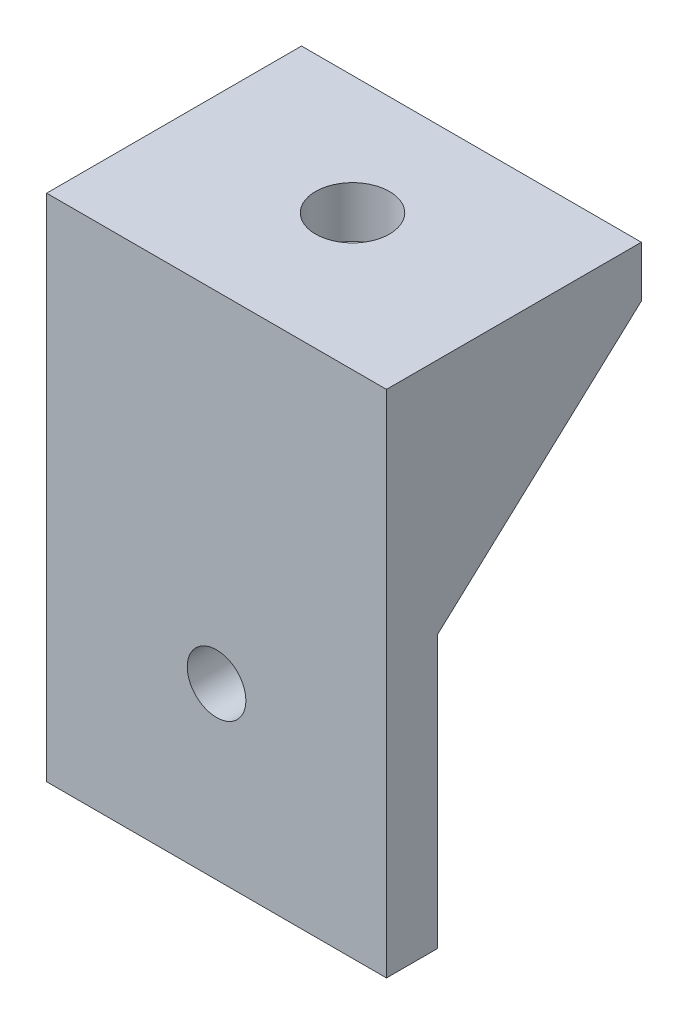
ISO-10303-21;
HEADER;
FILE_DESCRIPTION(('STEP AP214'),'2;1');
FILE_NAME('part.step','',(''),(''),'','','');
FILE_SCHEMA(('AUTOMOTIVE_DESIGN { 1 0 10303 214 1 1 1 1 }'));
ENDSEC;
DATA;
#1=APPLICATION_CONTEXT('core data for automotive mechanical design processes');
#2=APPLICATION_PROTOCOL_DEFINITION('international standard','automotive_design',2000,#1);
#3=PRODUCT_CONTEXT('',#1,'mechanical');
#4=PRODUCT('Part','Part','',(#3));
#5=PRODUCT_RELATED_PRODUCT_CATEGORY('part','',(#4));
#6=PRODUCT_DEFINITION_FORMATION('','',#4);
#7=PRODUCT_DEFINITION_CONTEXT('part definition',#1,'design');
#8=PRODUCT_DEFINITION('design','',#6,#7);
#9=PRODUCT_DEFINITION_SHAPE('','',#8);
#10=(LENGTH_UNIT() NAMED_UNIT(*) SI_UNIT(.MILLI.,.METRE.));
#11=(NAMED_UNIT(*) PLANE_ANGLE_UNIT() SI_UNIT($,.RADIAN.));
#12=(NAMED_UNIT(*) SI_UNIT($,.STERADIAN.) SOLID_ANGLE_UNIT());
#13=UNCERTAINTY_MEASURE_WITH_UNIT(LENGTH_MEASURE(1.E-05),#10,'distance_accuracy_value','');
#14=(GEOMETRIC_REPRESENTATION_CONTEXT(3) GLOBAL_UNCERTAINTY_ASSIGNED_CONTEXT((#13)) GLOBAL_UNIT_ASSIGNED_CONTEXT((#10,
#11,#12)) REPRESENTATION_CONTEXT('',''));
#15=CARTESIAN_POINT('',(0.,0.,0.));
#16=DIRECTION('',(0.,0.,1.));
#17=DIRECTION('',(1.,0.,0.));
#18=AXIS2_PLACEMENT_3D('',#15,#16,#17);
#19=CARTESIAN_POINT('',(0.,0.,0.));
#20=DIRECTION('',(0.,0.,1.));
#21=DIRECTION('',(1.,0.,0.));
#22=AXIS2_PLACEMENT_3D('',#19,#20,#21);
#23=PLANE('',#22);
#24=CARTESIAN_POINT('',(5.22292993630573,6.71974522292994,0.));
#25=DIRECTION('',(0.,0.,-1.));
#26=DIRECTION('',(-1.,0.,0.));
#27=AXIS2_PLACEMENT_3D('',#24,#25,#26);
#28=CIRCLE('',#27,1.725);
#29=CARTESIAN_POINT('',(3.49792993630573,6.71974522292994,0.));
#30=VERTEX_POINT('',#29);
#31=EDGE_CURVE('E157',#30,#30,#28,.T.);
#32=ORIENTED_EDGE('',*,*,#31,.F.);
#33=EDGE_LOOP('',(#32));
#34=FACE_BOUND('',#33,.T.);
#35=DIRECTION('',(0.,1.,0.));
#36=VECTOR('',#35,1.);
#37=CARTESIAN_POINT('',(13.2229299363057,23.7197452229299,0.));
#38=LINE('',#37,#36);
#39=CARTESIAN_POINT('',(13.2229299363057,12.7197452229299,0.));
#40=VERTEX_POINT('',#39);
#41=CARTESIAN_POINT('',(13.2229299363057,23.7197452229299,0.));
#42=VERTEX_POINT('',#41);
#43=EDGE_CURVE('E57',#40,#42,#38,.T.);
#44=ORIENTED_EDGE('',*,*,#43,.F.);
#45=DIRECTION('',(1.,0.,0.));
#46=VECTOR('',#45,1.);
#47=CARTESIAN_POINT('',(13.2229299363057,12.7197452229299,0.));
#48=LINE('',#47,#46);
#49=CARTESIAN_POINT('',(15.2229299363057,12.7197452229299,0.));
#50=VERTEX_POINT('',#49);
#51=EDGE_CURVE('E137',#40,#50,#48,.T.);
#52=ORIENTED_EDGE('',*,*,#51,.T.);
#53=DIRECTION('',(0.,1.,0.));
#54=VECTOR('',#53,1.);
#55=CARTESIAN_POINT('',(15.2229299363057,26.7197452229299,0.));
#56=LINE('',#55,#54);
#57=CARTESIAN_POINT('',(15.2229299363057,-3.28025477707006,0.));
#58=VERTEX_POINT('',#57);
#59=EDGE_CURVE('E176',#58,#50,#56,.T.);
#60=ORIENTED_EDGE('',*,*,#59,.F.);
#61=DIRECTION('',(1.,0.,0.));
#62=VECTOR('',#61,1.);
#63=CARTESIAN_POINT('',(-4.77707006369427,-3.28025477707006,0.));
#64=LINE('',#63,#62);
#65=CARTESIAN_POINT('',(-4.77707006369427,-3.28025477707006,0.));
#66=VERTEX_POINT('',#65);
#67=EDGE_CURVE('E183',#66,#58,#64,.T.);
#68=ORIENTED_EDGE('',*,*,#67,.F.);
#69=DIRECTION('',(0.,-1.,0.));
#70=VECTOR('',#69,1.);
#71=CARTESIAN_POINT('',(-4.77707006369427,26.7197452229299,0.));
#72=LINE('',#71,#70);
#73=CARTESIAN_POINT('',(-4.77707006369427,12.7197452229299,0.));
#74=VERTEX_POINT('',#73);
#75=EDGE_CURVE('E167',#74,#66,#72,.T.);
#76=ORIENTED_EDGE('',*,*,#75,.F.);
#77=DIRECTION('',(-1.,0.,0.));
#78=VECTOR('',#77,1.);
#79=CARTESIAN_POINT('',(-2.77707006369427,12.7197452229299,0.));
#80=LINE('',#79,#78);
#81=CARTESIAN_POINT('',(-2.77707006369427,12.7197452229299,0.));
#82=VERTEX_POINT('',#81);
#83=EDGE_CURVE('E151',#82,#74,#80,.T.);
#84=ORIENTED_EDGE('',*,*,#83,.F.);
#85=DIRECTION('',(0.,1.,0.));
#86=VECTOR('',#85,1.);
#87=CARTESIAN_POINT('',(-2.77707006369427,23.7197452229299,0.));
#88=LINE('',#87,#86);
#89=CARTESIAN_POINT('',(-2.77707006369427,23.7197452229299,0.));
#90=VERTEX_POINT('',#89);
#91=EDGE_CURVE('E150',#82,#90,#88,.T.);
#92=ORIENTED_EDGE('',*,*,#91,.T.);
#93=DIRECTION('',(-1.,0.,0.));
#94=VECTOR('',#93,1.);
#95=CARTESIAN_POINT('',(15.2229299363057,23.7197452229299,0.));
#96=LINE('',#95,#94);
#97=EDGE_CURVE('E165',#42,#90,#96,.T.);
#98=ORIENTED_EDGE('',*,*,#97,.F.);
#99=EDGE_LOOP('',(#44,#52,#60,#68,#76,#84,#92,#98));
#100=FACE_BOUND('',#99,.T.);
#101=ADVANCED_FACE('F39',(#34,#100),#23,.F.);
#102=CARTESIAN_POINT('',(15.2229299363057,23.7197452229299,-12.));
#103=DIRECTION('',(0.,1.,0.));
#104=DIRECTION('',(0.,0.,1.));
#105=AXIS2_PLACEMENT_3D('',#102,#103,#104);
#106=PLANE('',#105);
#107=CARTESIAN_POINT('',(5.22292993630573,23.7197452229299,-5.));
#108=DIRECTION('',(0.,1.,0.));
#109=DIRECTION('',(0.,0.,1.));
#110=AXIS2_PLACEMENT_3D('',#107,#108,#109);
#111=CIRCLE('',#110,2.175);
#112=CARTESIAN_POINT('',(5.22292993630573,23.7197452229299,-2.825));
#113=VERTEX_POINT('',#112);
#114=EDGE_CURVE('E161',#113,#113,#111,.T.);
#115=ORIENTED_EDGE('',*,*,#114,.T.);
#116=EDGE_LOOP('',(#115));
#117=FACE_BOUND('',#116,.T.);
#118=DIRECTION('',(0.,0.,-1.));
#119=VECTOR('',#118,1.);
#120=CARTESIAN_POINT('',(13.2229299363057,23.7197452229299,-12.));
#121=LINE('',#120,#119);
#122=CARTESIAN_POINT('',(13.2229299363057,23.7197452229299,-12.));
#123=VERTEX_POINT('',#122);
#124=EDGE_CURVE('E61',#42,#123,#121,.T.);
#125=ORIENTED_EDGE('',*,*,#124,.F.);
#126=ORIENTED_EDGE('',*,*,#97,.T.);
#127=DIRECTION('',(0.,0.,-1.));
#128=VECTOR('',#127,1.);
#129=CARTESIAN_POINT('',(-2.77707006369427,23.7197452229299,-12.));
#130=LINE('',#129,#128);
#131=CARTESIAN_POINT('',(-2.77707006369427,23.7197452229299,-12.));
#132=VERTEX_POINT('',#131);
#133=EDGE_CURVE('E126',#90,#132,#130,.T.);
#134=ORIENTED_EDGE('',*,*,#133,.T.);
#135=DIRECTION('',(-1.,0.,0.));
#136=VECTOR('',#135,1.);
#137=CARTESIAN_POINT('',(15.2229299363057,23.7197452229299,-12.));
#138=LINE('',#137,#136);
#139=EDGE_CURVE('E114',#123,#132,#138,.T.);
#140=ORIENTED_EDGE('',*,*,#139,.F.);
#141=EDGE_LOOP('',(#125,#126,#134,#140));
#142=FACE_BOUND('',#141,.T.);
#143=ADVANCED_FACE('F130',(#117,#142),#106,.F.);
#144=CARTESIAN_POINT('',(-4.77707006369427,26.7197452229299,3.));
#145=DIRECTION('',(1.,0.,0.));
#146=DIRECTION('',(0.,1.,0.));
#147=AXIS2_PLACEMENT_3D('',#144,#145,#146);
#148=PLANE('',#147);
#149=DIRECTION('',(0.,-0.675724628517346,0.737154140200741));
#150=VECTOR('',#149,1.);
#151=CARTESIAN_POINT('',(-4.77707006369427,12.7197452229299,0.));
#152=LINE('',#151,#150);
#153=CARTESIAN_POINT('',(-4.77707006369427,23.7197452229299,-12.));
#154=VERTEX_POINT('',#153);
#155=EDGE_CURVE('E141',#154,#74,#152,.T.);
#156=ORIENTED_EDGE('',*,*,#155,.T.);
#157=ORIENTED_EDGE('',*,*,#75,.T.);
#158=DIRECTION('',(0.,0.,-1.));
#159=VECTOR('',#158,1.);
#160=CARTESIAN_POINT('',(-4.77707006369427,-3.28025477707006,3.));
#161=LINE('',#160,#159);
#162=CARTESIAN_POINT('',(-4.77707006369427,-3.28025477707006,3.));
#163=VERTEX_POINT('',#162);
#164=EDGE_CURVE('E11',#163,#66,#161,.T.);
#165=ORIENTED_EDGE('',*,*,#164,.F.);
#166=DIRECTION('',(0.,-1.,0.));
#167=VECTOR('',#166,1.);
#168=CARTESIAN_POINT('',(-4.77707006369427,26.7197452229299,3.));
#169=LINE('',#168,#167);
#170=CARTESIAN_POINT('',(-4.77707006369427,26.7197452229299,3.));
#171=VERTEX_POINT('',#170);
#172=EDGE_CURVE('E175',#171,#163,#169,.T.);
#173=ORIENTED_EDGE('',*,*,#172,.F.);
#174=DIRECTION('',(0.,0.,-1.));
#175=VECTOR('',#174,1.);
#176=CARTESIAN_POINT('',(-4.77707006369427,26.7197452229299,3.));
#177=LINE('',#176,#175);
#178=CARTESIAN_POINT('',(-4.77707006369427,26.7197452229299,-12.));
#179=VERTEX_POINT('',#178);
#180=EDGE_CURVE('E185',#171,#179,#177,.T.);
#181=ORIENTED_EDGE('',*,*,#180,.T.);
#182=DIRECTION('',(0.,1.,0.));
#183=VECTOR('',#182,1.);
#184=CARTESIAN_POINT('',(-4.77707006369427,26.7197452229299,-12.));
#185=LINE('',#184,#183);
#186=EDGE_CURVE('E121',#154,#179,#185,.T.);
#187=ORIENTED_EDGE('',*,*,#186,.F.);
#188=EDGE_LOOP('',(#156,#157,#165,#173,#181,#187));
#189=FACE_BOUND('',#188,.T.);
#190=ADVANCED_FACE('F41',(#189),#148,.F.);
#191=CARTESIAN_POINT('',(-4.77707006369427,-3.28025477707006,3.));
#192=DIRECTION('',(0.,1.,0.));
#193=DIRECTION('',(0.,0.,1.));
#194=AXIS2_PLACEMENT_3D('',#191,#192,#193);
#195=PLANE('',#194);
#196=ORIENTED_EDGE('',*,*,#67,.T.);
#197=DIRECTION('',(0.,0.,-1.));
#198=VECTOR('',#197,1.);
#199=CARTESIAN_POINT('',(15.2229299363057,-3.28025477707006,3.));
#200=LINE('',#199,#198);
#201=CARTESIAN_POINT('',(15.2229299363057,-3.28025477707006,3.));
#202=VERTEX_POINT('',#201);
#203=EDGE_CURVE('E48',#202,#58,#200,.T.);
#204=ORIENTED_EDGE('',*,*,#203,.F.);
#205=DIRECTION('',(1.,0.,0.));
#206=VECTOR('',#205,1.);
#207=CARTESIAN_POINT('',(-4.77707006369427,-3.28025477707006,3.));
#208=LINE('',#207,#206);
#209=EDGE_CURVE('E174',#163,#202,#208,.T.);
#210=ORIENTED_EDGE('',*,*,#209,.F.);
#211=ORIENTED_EDGE('',*,*,#164,.T.);
#212=EDGE_LOOP('',(#196,#204,#210,#211));
#213=FACE_BOUND('',#212,.T.);
#214=ADVANCED_FACE('F226',(#213),#195,.F.);
#215=CARTESIAN_POINT('',(15.2229299363057,26.7197452229299,3.));
#216=DIRECTION('',(-1.,0.,0.));
#217=DIRECTION('',(0.,0.,1.));
#218=AXIS2_PLACEMENT_3D('',#215,#216,#217);
#219=PLANE('',#218);
#220=ORIENTED_EDGE('',*,*,#59,.T.);
#221=DIRECTION('',(0.,-0.675724628517346,0.737154140200741));
#222=VECTOR('',#221,1.);
#223=CARTESIAN_POINT('',(15.2229299363057,12.7197452229299,0.));
#224=LINE('',#223,#222);
#225=CARTESIAN_POINT('',(15.2229299363057,23.7197452229299,-12.));
#226=VERTEX_POINT('',#225);
#227=EDGE_CURVE('E139',#226,#50,#224,.T.);
#228=ORIENTED_EDGE('',*,*,#227,.F.);
#229=DIRECTION('',(0.,-1.,0.));
#230=VECTOR('',#229,1.);
#231=CARTESIAN_POINT('',(15.2229299363057,26.7197452229299,-12.));
#232=LINE('',#231,#230);
#233=CARTESIAN_POINT('',(15.2229299363057,26.7197452229299,-12.));
#234=VERTEX_POINT('',#233);
#235=EDGE_CURVE('E118',#234,#226,#232,.T.);
#236=ORIENTED_EDGE('',*,*,#235,.F.);
#237=DIRECTION('',(0.,0.,-1.));
#238=VECTOR('',#237,1.);
#239=CARTESIAN_POINT('',(15.2229299363057,26.7197452229299,3.));
#240=LINE('',#239,#238);
#241=CARTESIAN_POINT('',(15.2229299363057,26.7197452229299,3.));
#242=VERTEX_POINT('',#241);
#243=EDGE_CURVE('E186',#242,#234,#240,.T.);
#244=ORIENTED_EDGE('',*,*,#243,.F.);
#245=DIRECTION('',(0.,1.,0.));
#246=VECTOR('',#245,1.);
#247=CARTESIAN_POINT('',(15.2229299363057,26.7197452229299,3.));
#248=LINE('',#247,#246);
#249=EDGE_CURVE('E178',#202,#242,#248,.T.);
#250=ORIENTED_EDGE('',*,*,#249,.F.);
#251=ORIENTED_EDGE('',*,*,#203,.T.);
#252=EDGE_LOOP('',(#220,#228,#236,#244,#250,#251));
#253=FACE_BOUND('',#252,.T.);
#254=ADVANCED_FACE('F223',(#253),#219,.F.);
#255=CARTESIAN_POINT('',(-4.77707006369427,26.7197452229299,3.));
#256=DIRECTION('',(0.,-1.,0.));
#257=DIRECTION('',(0.,0.,-1.));
#258=AXIS2_PLACEMENT_3D('',#255,#256,#257);
#259=PLANE('',#258);
#260=CARTESIAN_POINT('',(5.22292993630573,26.7197452229299,-5.));
#261=DIRECTION('',(0.,1.,0.));
#262=DIRECTION('',(0.,0.,1.));
#263=AXIS2_PLACEMENT_3D('',#260,#261,#262);
#264=CIRCLE('',#263,2.175);
#265=CARTESIAN_POINT('',(5.22292993630573,26.7197452229299,-2.825));
#266=VERTEX_POINT('',#265);
#267=EDGE_CURVE('E158',#266,#266,#264,.T.);
#268=ORIENTED_EDGE('',*,*,#267,.F.);
#269=EDGE_LOOP('',(#268));
#270=FACE_BOUND('',#269,.T.);
#271=ORIENTED_EDGE('',*,*,#243,.T.);
#272=DIRECTION('',(1.,0.,0.));
#273=VECTOR('',#272,1.);
#274=CARTESIAN_POINT('',(15.2229299363057,26.7197452229299,-12.));
#275=LINE('',#274,#273);
#276=EDGE_CURVE('E166',#179,#234,#275,.T.);
#277=ORIENTED_EDGE('',*,*,#276,.F.);
#278=ORIENTED_EDGE('',*,*,#180,.F.);
#279=DIRECTION('',(-1.,0.,0.));
#280=VECTOR('',#279,1.);
#281=CARTESIAN_POINT('',(-4.77707006369427,26.7197452229299,3.));
#282=LINE('',#281,#280);
#283=EDGE_CURVE('E179',#242,#171,#282,.T.);
#284=ORIENTED_EDGE('',*,*,#283,.F.);
#285=EDGE_LOOP('',(#271,#277,#278,#284));
#286=FACE_BOUND('',#285,.T.);
#287=ADVANCED_FACE('F225',(#270,#286),#259,.F.);
#288=CARTESIAN_POINT('',(0.,0.,3.));
#289=DIRECTION('',(0.,0.,1.));
#290=DIRECTION('',(1.,0.,0.));
#291=AXIS2_PLACEMENT_3D('',#288,#289,#290);
#292=PLANE('',#291);
#293=CARTESIAN_POINT('',(5.22292993630573,6.71974522292994,3.));
#294=DIRECTION('',(0.,0.,1.));
#295=DIRECTION('',(1.,0.,0.));
#296=AXIS2_PLACEMENT_3D('',#293,#294,#295);
#297=CIRCLE('',#296,1.725);
#298=CARTESIAN_POINT('',(6.94792993630573,6.71974522292994,3.));
#299=VERTEX_POINT('',#298);
#300=EDGE_CURVE('E43',#299,#299,#297,.T.);
#301=ORIENTED_EDGE('',*,*,#300,.F.);
#302=EDGE_LOOP('',(#301));
#303=FACE_BOUND('',#302,.T.);
#304=ORIENTED_EDGE('',*,*,#172,.T.);
#305=ORIENTED_EDGE('',*,*,#209,.T.);
#306=ORIENTED_EDGE('',*,*,#249,.T.);
#307=ORIENTED_EDGE('',*,*,#283,.T.);
#308=EDGE_LOOP('',(#304,#305,#306,#307));
#309=FACE_BOUND('',#308,.T.);
#310=ADVANCED_FACE('F208',(#303,#309),#292,.T.);
#311=CARTESIAN_POINT('',(0.,0.,-12.));
#312=DIRECTION('',(0.,0.,-1.));
#313=DIRECTION('',(-1.,0.,0.));
#314=AXIS2_PLACEMENT_3D('',#311,#312,#313);
#315=PLANE('',#314);
#316=ORIENTED_EDGE('',*,*,#235,.T.);
#317=EDGE_CURVE('E115',#226,#123,#138,.T.);
#318=ORIENTED_EDGE('',*,*,#317,.T.);
#319=ORIENTED_EDGE('',*,*,#139,.T.);
#320=DIRECTION('',(-1.,0.,0.));
#321=VECTOR('',#320,1.);
#322=CARTESIAN_POINT('',(-2.77707006369427,23.7197452229299,-12.));
#323=LINE('',#322,#321);
#324=EDGE_CURVE('E152',#132,#154,#323,.T.);
#325=ORIENTED_EDGE('',*,*,#324,.T.);
#326=ORIENTED_EDGE('',*,*,#186,.T.);
#327=ORIENTED_EDGE('',*,*,#276,.T.);
#328=EDGE_LOOP('',(#316,#318,#319,#325,#326,#327));
#329=FACE_BOUND('',#328,.T.);
#330=ADVANCED_FACE('F113',(#329),#315,.T.);
#331=CARTESIAN_POINT('',(5.22292993630573,14.7197452229299,-5.));
#332=DIRECTION('',(0.,1.,0.));
#333=DIRECTION('',(0.,0.,1.));
#334=AXIS2_PLACEMENT_3D('',#331,#332,#333);
#335=CYLINDRICAL_SURFACE('',#334,2.175);
#336=ORIENTED_EDGE('',*,*,#267,.T.);
#337=EDGE_LOOP('',(#336));
#338=FACE_BOUND('',#337,.T.);
#339=ORIENTED_EDGE('',*,*,#114,.F.);
#340=EDGE_LOOP('',(#339));
#341=FACE_BOUND('',#340,.T.);
#342=ADVANCED_FACE('F196',(#338,#341),#335,.F.);
#343=CARTESIAN_POINT('',(5.22292993630573,6.71974522292994,12.));
#344=DIRECTION('',(0.,0.,-1.));
#345=DIRECTION('',(-1.,0.,0.));
#346=AXIS2_PLACEMENT_3D('',#343,#344,#345);
#347=CYLINDRICAL_SURFACE('',#346,1.725);
#348=ORIENTED_EDGE('',*,*,#300,.T.);
#349=EDGE_LOOP('',(#348));
#350=FACE_BOUND('',#349,.T.);
#351=ORIENTED_EDGE('',*,*,#31,.T.);
#352=EDGE_LOOP('',(#351));
#353=FACE_BOUND('',#352,.T.);
#354=ADVANCED_FACE('F198',(#350,#353),#347,.F.);
#355=CARTESIAN_POINT('',(-2.77707006369427,12.7197452229299,0.));
#356=DIRECTION('',(0.,-0.737154140200741,-0.675724628517346));
#357=DIRECTION('',(0.,0.675724628517346,-0.737154140200741));
#358=AXIS2_PLACEMENT_3D('',#355,#356,#357);
#359=PLANE('',#358);
#360=ORIENTED_EDGE('',*,*,#155,.F.);
#361=ORIENTED_EDGE('',*,*,#324,.F.);
#362=DIRECTION('',(0.,-0.675724628517346,0.737154140200741));
#363=VECTOR('',#362,1.);
#364=CARTESIAN_POINT('',(-2.77707006369427,12.7197452229299,0.));
#365=LINE('',#364,#363);
#366=EDGE_CURVE('E144',#132,#82,#365,.T.);
#367=ORIENTED_EDGE('',*,*,#366,.T.);
#368=ORIENTED_EDGE('',*,*,#83,.T.);
#369=EDGE_LOOP('',(#360,#361,#367,#368));
#370=FACE_BOUND('',#369,.T.);
#371=ADVANCED_FACE('F207',(#370),#359,.T.);
#372=CARTESIAN_POINT('',(-2.77707006369427,0.,0.));
#373=DIRECTION('',(-1.,0.,0.));
#374=DIRECTION('',(0.,-1.,0.));
#375=AXIS2_PLACEMENT_3D('',#372,#373,#374);
#376=PLANE('',#375);
#377=ORIENTED_EDGE('',*,*,#366,.F.);
#378=ORIENTED_EDGE('',*,*,#133,.F.);
#379=ORIENTED_EDGE('',*,*,#91,.F.);
#380=EDGE_LOOP('',(#377,#378,#379));
#381=FACE_BOUND('',#380,.T.);
#382=ADVANCED_FACE('F255',(#381),#376,.F.);
#383=CARTESIAN_POINT('',(13.2229299363057,12.7197452229299,0.));
#384=DIRECTION('',(0.,0.737154140200741,0.675724628517346));
#385=DIRECTION('',(0.,-0.675724628517346,0.737154140200741));
#386=AXIS2_PLACEMENT_3D('',#383,#384,#385);
#387=PLANE('',#386);
#388=ORIENTED_EDGE('',*,*,#227,.T.);
#389=ORIENTED_EDGE('',*,*,#51,.F.);
#390=DIRECTION('',(0.,-0.675724628517346,0.737154140200741));
#391=VECTOR('',#390,1.);
#392=CARTESIAN_POINT('',(13.2229299363057,12.7197452229299,0.));
#393=LINE('',#392,#391);
#394=EDGE_CURVE('E135',#123,#40,#393,.T.);
#395=ORIENTED_EDGE('',*,*,#394,.F.);
#396=ORIENTED_EDGE('',*,*,#317,.F.);
#397=EDGE_LOOP('',(#388,#389,#395,#396));
#398=FACE_BOUND('',#397,.T.);
#399=ADVANCED_FACE('F134',(#398),#387,.F.);
#400=CARTESIAN_POINT('',(13.2229299363057,0.,0.));
#401=DIRECTION('',(1.,0.,0.));
#402=DIRECTION('',(0.,-1.,0.));
#403=AXIS2_PLACEMENT_3D('',#400,#401,#402);
#404=PLANE('',#403);
#405=ORIENTED_EDGE('',*,*,#394,.T.);
#406=ORIENTED_EDGE('',*,*,#43,.T.);
#407=ORIENTED_EDGE('',*,*,#124,.T.);
#408=EDGE_LOOP('',(#405,#406,#407));
#409=FACE_BOUND('',#408,.T.);
#410=ADVANCED_FACE('F131',(#409),#404,.F.);
#411=CLOSED_SHELL('',(#101,#143,#190,#214,#254,#287,#310,#330,#342,#354,#371,#382,#399,#410));
#412=MANIFOLD_SOLID_BREP('B2',#411);
#413=ADVANCED_BREP_SHAPE_REPRESENTATION('',(#18,#412),#14);
#414=SHAPE_DEFINITION_REPRESENTATION(#9,#413);
ENDSEC;
END-ISO-10303-21;
